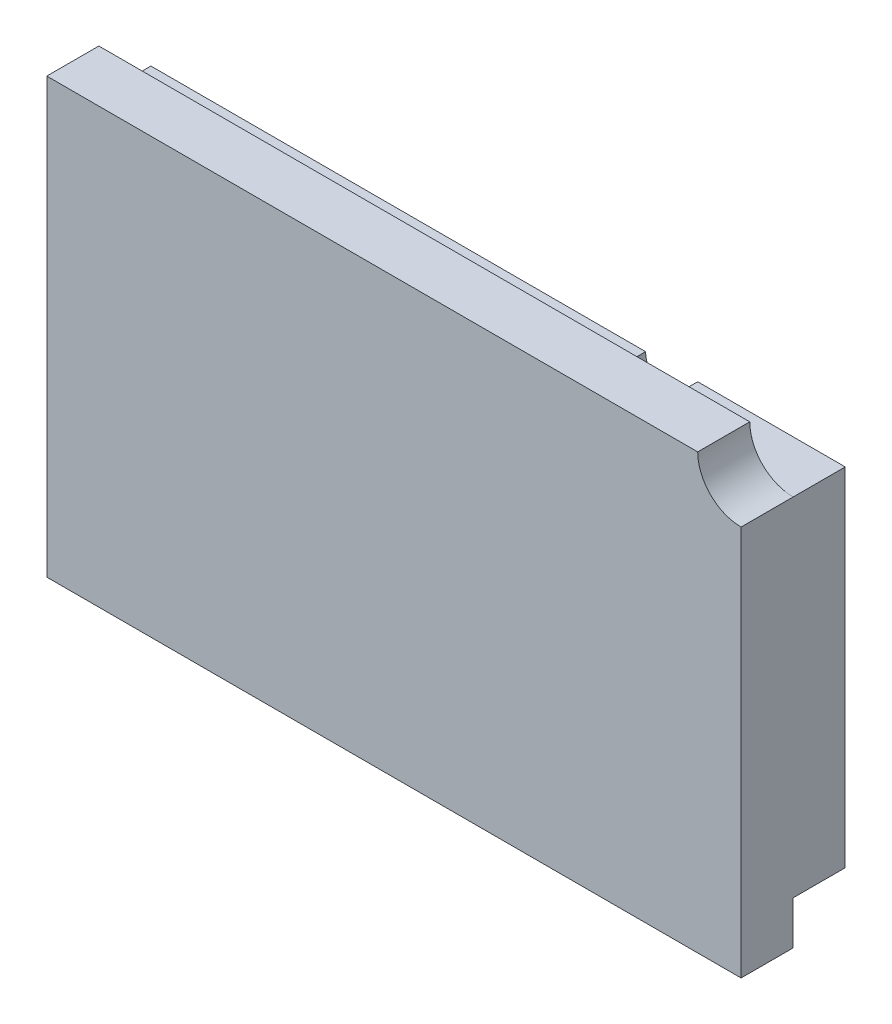
ISO-10303-21;
HEADER;
FILE_DESCRIPTION(('STEP AP214'),'2;1');
FILE_NAME('part.step','',(''),(''),'','','');
FILE_SCHEMA(('AUTOMOTIVE_DESIGN { 1 0 10303 214 1 1 1 1 }'));
ENDSEC;
DATA;
#1=APPLICATION_CONTEXT('core data for automotive mechanical design processes');
#2=APPLICATION_PROTOCOL_DEFINITION('international standard','automotive_design',2000,#1);
#3=PRODUCT_CONTEXT('',#1,'mechanical');
#4=PRODUCT('Part','Part','',(#3));
#5=PRODUCT_RELATED_PRODUCT_CATEGORY('part','',(#4));
#6=PRODUCT_DEFINITION_FORMATION('','',#4);
#7=PRODUCT_DEFINITION_CONTEXT('part definition',#1,'design');
#8=PRODUCT_DEFINITION('design','',#6,#7);
#9=PRODUCT_DEFINITION_SHAPE('','',#8);
#10=(LENGTH_UNIT() NAMED_UNIT(*) SI_UNIT(.MILLI.,.METRE.));
#11=(NAMED_UNIT(*) PLANE_ANGLE_UNIT() SI_UNIT($,.RADIAN.));
#12=(NAMED_UNIT(*) SI_UNIT($,.STERADIAN.) SOLID_ANGLE_UNIT());
#13=UNCERTAINTY_MEASURE_WITH_UNIT(LENGTH_MEASURE(1.E-05),#10,'distance_accuracy_value','');
#14=(GEOMETRIC_REPRESENTATION_CONTEXT(3) GLOBAL_UNCERTAINTY_ASSIGNED_CONTEXT((#13)) GLOBAL_UNIT_ASSIGNED_CONTEXT((#10,
#11,#12)) REPRESENTATION_CONTEXT('',''));
#15=CARTESIAN_POINT('',(0.,0.,0.));
#16=DIRECTION('',(0.,0.,1.));
#17=DIRECTION('',(1.,0.,0.));
#18=AXIS2_PLACEMENT_3D('',#15,#16,#17);
#19=CARTESIAN_POINT('',(40.,25.,6.));
#20=DIRECTION('',(0.,0.,-1.));
#21=DIRECTION('',(1.,0.,0.));
#22=AXIS2_PLACEMENT_3D('',#19,#20,#21);
#23=CYLINDRICAL_SURFACE('',#22,5.);
#24=CARTESIAN_POINT('',(40.,25.,6.));
#25=DIRECTION('',(0.,0.,1.));
#26=DIRECTION('',(1.,0.,0.));
#27=AXIS2_PLACEMENT_3D('',#24,#25,#26);
#28=CIRCLE('',#27,5.);
#29=CARTESIAN_POINT('',(35.,25.,6.));
#30=VERTEX_POINT('',#29);
#31=CARTESIAN_POINT('',(40.,20.,6.));
#32=VERTEX_POINT('',#31);
#33=EDGE_CURVE('E220',#30,#32,#28,.T.);
#34=ORIENTED_EDGE('',*,*,#33,.F.);
#35=DIRECTION('',(0.,0.,-1.));
#36=VECTOR('',#35,1.);
#37=CARTESIAN_POINT('',(35.,25.,6.));
#38=LINE('',#37,#36);
#39=CARTESIAN_POINT('',(35.,25.,12.));
#40=VERTEX_POINT('',#39);
#41=EDGE_CURVE('E24',#40,#30,#38,.T.);
#42=ORIENTED_EDGE('',*,*,#41,.F.);
#43=CARTESIAN_POINT('',(40.,25.,12.));
#44=DIRECTION('',(0.,0.,-1.));
#45=DIRECTION('',(1.,0.,0.));
#46=AXIS2_PLACEMENT_3D('',#43,#44,#45);
#47=CIRCLE('',#46,5.);
#48=CARTESIAN_POINT('',(40.,20.,12.));
#49=VERTEX_POINT('',#48);
#50=EDGE_CURVE('E10',#49,#40,#47,.T.);
#51=ORIENTED_EDGE('',*,*,#50,.F.);
#52=DIRECTION('',(0.,0.,-1.));
#53=VECTOR('',#52,1.);
#54=CARTESIAN_POINT('',(40.,20.,6.));
#55=LINE('',#54,#53);
#56=EDGE_CURVE('E161',#49,#32,#55,.T.);
#57=ORIENTED_EDGE('',*,*,#56,.T.);
#58=EDGE_LOOP('',(#34,#42,#51,#57));
#59=FACE_BOUND('',#58,.T.);
#60=ADVANCED_FACE('F16',(#59),#23,.F.);
#61=CARTESIAN_POINT('',(0.,0.,12.));
#62=DIRECTION('',(0.,0.,1.));
#63=DIRECTION('',(1.,0.,0.));
#64=AXIS2_PLACEMENT_3D('',#61,#62,#63);
#65=PLANE('',#64);
#66=DIRECTION('',(0.,-1.,0.));
#67=VECTOR('',#66,1.);
#68=CARTESIAN_POINT('',(-40.,25.,12.));
#69=LINE('',#68,#67);
#70=CARTESIAN_POINT('',(-40.,25.,12.));
#71=VERTEX_POINT('',#70);
#72=CARTESIAN_POINT('',(-40.,-25.,12.));
#73=VERTEX_POINT('',#72);
#74=EDGE_CURVE('E157',#71,#73,#69,.T.);
#75=ORIENTED_EDGE('',*,*,#74,.T.);
#76=DIRECTION('',(1.,0.,0.));
#77=VECTOR('',#76,1.);
#78=CARTESIAN_POINT('',(-40.,-25.,12.));
#79=LINE('',#78,#77);
#80=CARTESIAN_POINT('',(40.,-25.,12.));
#81=VERTEX_POINT('',#80);
#82=EDGE_CURVE('E217',#73,#81,#79,.T.);
#83=ORIENTED_EDGE('',*,*,#82,.T.);
#84=DIRECTION('',(0.,1.,0.));
#85=VECTOR('',#84,1.);
#86=CARTESIAN_POINT('',(40.,-25.,12.));
#87=LINE('',#86,#85);
#88=EDGE_CURVE('E164',#81,#49,#87,.T.);
#89=ORIENTED_EDGE('',*,*,#88,.T.);
#90=ORIENTED_EDGE('',*,*,#50,.T.);
#91=DIRECTION('',(-1.,0.,0.));
#92=VECTOR('',#91,1.);
#93=CARTESIAN_POINT('',(40.,25.,12.));
#94=LINE('',#93,#92);
#95=EDGE_CURVE('E236',#40,#71,#94,.T.);
#96=ORIENTED_EDGE('',*,*,#95,.T.);
#97=EDGE_LOOP('',(#75,#83,#89,#90,#96));
#98=FACE_BOUND('',#97,.T.);
#99=ADVANCED_FACE('F335',(#98),#65,.T.);
#100=CARTESIAN_POINT('',(40.,25.,6.));
#101=DIRECTION('',(0.,-1.,0.));
#102=DIRECTION('',(0.,0.,-1.));
#103=AXIS2_PLACEMENT_3D('',#100,#101,#102);
#104=PLANE('',#103);
#105=DIRECTION('',(0.,0.,1.));
#106=VECTOR('',#105,1.);
#107=CARTESIAN_POINT('',(-40.,25.,6.));
#108=LINE('',#107,#106);
#109=CARTESIAN_POINT('',(-40.,25.,6.));
#110=VERTEX_POINT('',#109);
#111=EDGE_CURVE('E172',#110,#71,#108,.T.);
#112=ORIENTED_EDGE('',*,*,#111,.T.);
#113=ORIENTED_EDGE('',*,*,#95,.F.);
#114=ORIENTED_EDGE('',*,*,#41,.T.);
#115=DIRECTION('',(-1.,0.,0.));
#116=VECTOR('',#115,1.);
#117=CARTESIAN_POINT('',(40.,25.,6.));
#118=LINE('',#117,#116);
#119=EDGE_CURVE('E233',#30,#110,#118,.T.);
#120=ORIENTED_EDGE('',*,*,#119,.T.);
#121=EDGE_LOOP('',(#112,#113,#114,#120));
#122=FACE_BOUND('',#121,.T.);
#123=ADVANCED_FACE('F326',(#122),#104,.F.);
#124=CARTESIAN_POINT('',(0.,0.,6.));
#125=DIRECTION('',(0.,0.,1.));
#126=DIRECTION('',(1.,0.,0.));
#127=AXIS2_PLACEMENT_3D('',#124,#125,#126);
#128=PLANE('',#127);
#129=ORIENTED_EDGE('',*,*,#33,.T.);
#130=DIRECTION('',(-1.,0.,0.));
#131=VECTOR('',#130,1.);
#132=CARTESIAN_POINT('',(40.,20.,6.));
#133=LINE('',#132,#131);
#134=CARTESIAN_POINT('',(23.,20.,6.));
#135=VERTEX_POINT('',#134);
#136=EDGE_CURVE('E225',#32,#135,#133,.T.);
#137=ORIENTED_EDGE('',*,*,#136,.T.);
#138=CARTESIAN_POINT('',(20.,20.,6.));
#139=DIRECTION('',(0.,0.,-1.));
#140=DIRECTION('',(1.,0.,0.));
#141=AXIS2_PLACEMENT_3D('',#138,#139,#140);
#142=CIRCLE('',#141,3.);
#143=CARTESIAN_POINT('',(17.,20.,6.));
#144=VERTEX_POINT('',#143);
#145=EDGE_CURVE('E221',#135,#144,#142,.T.);
#146=ORIENTED_EDGE('',*,*,#145,.T.);
#147=DIRECTION('',(-1.,0.,0.));
#148=VECTOR('',#147,1.);
#149=CARTESIAN_POINT('',(40.,20.,6.));
#150=LINE('',#149,#148);
#151=CARTESIAN_POINT('',(-40.,20.,6.));
#152=VERTEX_POINT('',#151);
#153=EDGE_CURVE('E210',#144,#152,#150,.T.);
#154=ORIENTED_EDGE('',*,*,#153,.T.);
#155=DIRECTION('',(0.,-1.,0.));
#156=VECTOR('',#155,1.);
#157=CARTESIAN_POINT('',(-40.,25.,6.));
#158=LINE('',#157,#156);
#159=EDGE_CURVE('E169',#110,#152,#158,.T.);
#160=ORIENTED_EDGE('',*,*,#159,.F.);
#161=ORIENTED_EDGE('',*,*,#119,.F.);
#162=EDGE_LOOP('',(#129,#137,#146,#154,#160,#161));
#163=FACE_BOUND('',#162,.T.);
#164=ADVANCED_FACE('F317',(#163),#128,.F.);
#165=CARTESIAN_POINT('',(-40.,-25.,6.));
#166=DIRECTION('',(0.,1.,0.));
#167=DIRECTION('',(1.,0.,0.));
#168=AXIS2_PLACEMENT_3D('',#165,#166,#167);
#169=PLANE('',#168);
#170=DIRECTION('',(1.,0.,0.));
#171=VECTOR('',#170,1.);
#172=CARTESIAN_POINT('',(-40.,-25.,6.));
#173=LINE('',#172,#171);
#174=CARTESIAN_POINT('',(-40.,-25.,6.));
#175=VERTEX_POINT('',#174);
#176=CARTESIAN_POINT('',(40.,-25.,6.));
#177=VERTEX_POINT('',#176);
#178=EDGE_CURVE('E207',#175,#177,#173,.T.);
#179=ORIENTED_EDGE('',*,*,#178,.T.);
#180=DIRECTION('',(0.,0.,1.));
#181=VECTOR('',#180,1.);
#182=CARTESIAN_POINT('',(40.,-25.,6.));
#183=LINE('',#182,#181);
#184=EDGE_CURVE('E190',#177,#81,#183,.T.);
#185=ORIENTED_EDGE('',*,*,#184,.T.);
#186=ORIENTED_EDGE('',*,*,#82,.F.);
#187=DIRECTION('',(0.,0.,1.));
#188=VECTOR('',#187,1.);
#189=CARTESIAN_POINT('',(-40.,-25.,6.));
#190=LINE('',#189,#188);
#191=EDGE_CURVE('E175',#175,#73,#190,.T.);
#192=ORIENTED_EDGE('',*,*,#191,.F.);
#193=EDGE_LOOP('',(#179,#185,#186,#192));
#194=FACE_BOUND('',#193,.T.);
#195=ADVANCED_FACE('F301',(#194),#169,.F.);
#196=CARTESIAN_POINT('',(20.,20.,0.));
#197=DIRECTION('',(0.,0.,-1.));
#198=DIRECTION('',(1.,0.,0.));
#199=AXIS2_PLACEMENT_3D('',#196,#197,#198);
#200=CYLINDRICAL_SURFACE('',#199,3.);
#201=DIRECTION('',(0.,0.,1.));
#202=VECTOR('',#201,1.);
#203=CARTESIAN_POINT('',(23.,20.,0.));
#204=LINE('',#203,#202);
#205=CARTESIAN_POINT('',(23.,20.,0.));
#206=VERTEX_POINT('',#205);
#207=EDGE_CURVE('E216',#206,#135,#204,.T.);
#208=ORIENTED_EDGE('',*,*,#207,.F.);
#209=CARTESIAN_POINT('',(20.,20.,0.));
#210=DIRECTION('',(0.,0.,1.));
#211=DIRECTION('',(1.,0.,0.));
#212=AXIS2_PLACEMENT_3D('',#209,#210,#211);
#213=CIRCLE('',#212,3.);
#214=CARTESIAN_POINT('',(17.,20.,0.));
#215=VERTEX_POINT('',#214);
#216=EDGE_CURVE('E184',#215,#206,#213,.T.);
#217=ORIENTED_EDGE('',*,*,#216,.F.);
#218=DIRECTION('',(0.,0.,-1.));
#219=VECTOR('',#218,1.);
#220=CARTESIAN_POINT('',(17.,20.,0.));
#221=LINE('',#220,#219);
#222=EDGE_CURVE('E213',#144,#215,#221,.T.);
#223=ORIENTED_EDGE('',*,*,#222,.F.);
#224=ORIENTED_EDGE('',*,*,#145,.F.);
#225=EDGE_LOOP('',(#208,#217,#223,#224));
#226=FACE_BOUND('',#225,.T.);
#227=ADVANCED_FACE('F284',(#226),#200,.F.);
#228=CARTESIAN_POINT('',(40.,20.,0.));
#229=DIRECTION('',(0.,-1.,0.));
#230=DIRECTION('',(0.,0.,-1.));
#231=AXIS2_PLACEMENT_3D('',#228,#229,#230);
#232=PLANE('',#231);
#233=ORIENTED_EDGE('',*,*,#207,.T.);
#234=ORIENTED_EDGE('',*,*,#136,.F.);
#235=DIRECTION('',(0.,0.,1.));
#236=VECTOR('',#235,1.);
#237=CARTESIAN_POINT('',(40.,20.,0.));
#238=LINE('',#237,#236);
#239=CARTESIAN_POINT('',(40.,20.,0.));
#240=VERTEX_POINT('',#239);
#241=EDGE_CURVE('E165',#240,#32,#238,.T.);
#242=ORIENTED_EDGE('',*,*,#241,.F.);
#243=DIRECTION('',(-1.,0.,0.));
#244=VECTOR('',#243,1.);
#245=CARTESIAN_POINT('',(40.,20.,0.));
#246=LINE('',#245,#244);
#247=EDGE_CURVE('E188',#240,#206,#246,.T.);
#248=ORIENTED_EDGE('',*,*,#247,.T.);
#249=EDGE_LOOP('',(#233,#234,#242,#248));
#250=FACE_BOUND('',#249,.T.);
#251=ADVANCED_FACE('F278',(#250),#232,.F.);
#252=CARTESIAN_POINT('',(40.,20.,0.));
#253=DIRECTION('',(0.,-1.,0.));
#254=DIRECTION('',(0.,0.,-1.));
#255=AXIS2_PLACEMENT_3D('',#252,#253,#254);
#256=PLANE('',#255);
#257=DIRECTION('',(0.,0.,1.));
#258=VECTOR('',#257,1.);
#259=CARTESIAN_POINT('',(-40.,20.,0.));
#260=LINE('',#259,#258);
#261=CARTESIAN_POINT('',(-40.,20.,0.));
#262=VERTEX_POINT('',#261);
#263=EDGE_CURVE('E129',#262,#152,#260,.T.);
#264=ORIENTED_EDGE('',*,*,#263,.T.);
#265=ORIENTED_EDGE('',*,*,#153,.F.);
#266=ORIENTED_EDGE('',*,*,#222,.T.);
#267=DIRECTION('',(-1.,0.,0.));
#268=VECTOR('',#267,1.);
#269=CARTESIAN_POINT('',(40.,20.,0.));
#270=LINE('',#269,#268);
#271=EDGE_CURVE('E189',#215,#262,#270,.T.);
#272=ORIENTED_EDGE('',*,*,#271,.T.);
#273=EDGE_LOOP('',(#264,#265,#266,#272));
#274=FACE_BOUND('',#273,.T.);
#275=ADVANCED_FACE('F283',(#274),#256,.F.);
#276=CARTESIAN_POINT('',(0.,0.,6.));
#277=DIRECTION('',(0.,0.,1.));
#278=DIRECTION('',(1.,0.,0.));
#279=AXIS2_PLACEMENT_3D('',#276,#277,#278);
#280=PLANE('',#279);
#281=DIRECTION('',(0.,1.,0.));
#282=VECTOR('',#281,1.);
#283=CARTESIAN_POINT('',(40.,-25.,6.));
#284=LINE('',#283,#282);
#285=CARTESIAN_POINT('',(40.,-20.,6.));
#286=VERTEX_POINT('',#285);
#287=EDGE_CURVE('E194',#177,#286,#284,.T.);
#288=ORIENTED_EDGE('',*,*,#287,.F.);
#289=ORIENTED_EDGE('',*,*,#178,.F.);
#290=DIRECTION('',(0.,-1.,0.));
#291=VECTOR('',#290,1.);
#292=CARTESIAN_POINT('',(-40.,25.,6.));
#293=LINE('',#292,#291);
#294=CARTESIAN_POINT('',(-40.,-20.,6.));
#295=VERTEX_POINT('',#294);
#296=EDGE_CURVE('E134',#295,#175,#293,.T.);
#297=ORIENTED_EDGE('',*,*,#296,.F.);
#298=DIRECTION('',(1.,0.,0.));
#299=VECTOR('',#298,1.);
#300=CARTESIAN_POINT('',(-40.,-20.,6.));
#301=LINE('',#300,#299);
#302=EDGE_CURVE('E142',#295,#286,#301,.T.);
#303=ORIENTED_EDGE('',*,*,#302,.T.);
#304=EDGE_LOOP('',(#288,#289,#297,#303));
#305=FACE_BOUND('',#304,.T.);
#306=ADVANCED_FACE('F273',(#305),#280,.F.);
#307=CARTESIAN_POINT('',(0.,0.,0.));
#308=DIRECTION('',(0.,0.,1.));
#309=DIRECTION('',(1.,0.,0.));
#310=AXIS2_PLACEMENT_3D('',#307,#308,#309);
#311=PLANE('',#310);
#312=ORIENTED_EDGE('',*,*,#271,.F.);
#313=ORIENTED_EDGE('',*,*,#216,.T.);
#314=ORIENTED_EDGE('',*,*,#247,.F.);
#315=DIRECTION('',(0.,1.,0.));
#316=VECTOR('',#315,1.);
#317=CARTESIAN_POINT('',(40.,-20.,0.));
#318=LINE('',#317,#316);
#319=CARTESIAN_POINT('',(40.,-20.,0.));
#320=VERTEX_POINT('',#319);
#321=EDGE_CURVE('E147',#320,#240,#318,.T.);
#322=ORIENTED_EDGE('',*,*,#321,.F.);
#323=DIRECTION('',(1.,0.,0.));
#324=VECTOR('',#323,1.);
#325=CARTESIAN_POINT('',(-40.,-20.,0.));
#326=LINE('',#325,#324);
#327=CARTESIAN_POINT('',(-40.,-20.,0.));
#328=VERTEX_POINT('',#327);
#329=EDGE_CURVE('E140',#328,#320,#326,.T.);
#330=ORIENTED_EDGE('',*,*,#329,.F.);
#331=DIRECTION('',(0.,-1.,0.));
#332=VECTOR('',#331,1.);
#333=CARTESIAN_POINT('',(-40.,20.,0.));
#334=LINE('',#333,#332);
#335=EDGE_CURVE('E121',#262,#328,#334,.T.);
#336=ORIENTED_EDGE('',*,*,#335,.F.);
#337=EDGE_LOOP('',(#312,#313,#314,#322,#330,#336));
#338=FACE_BOUND('',#337,.T.);
#339=ADVANCED_FACE('F145',(#338),#311,.F.);
#340=CARTESIAN_POINT('',(40.,-20.,0.));
#341=DIRECTION('',(-1.,0.,0.));
#342=DIRECTION('',(0.,0.,1.));
#343=AXIS2_PLACEMENT_3D('',#340,#341,#342);
#344=PLANE('',#343);
#345=ORIENTED_EDGE('',*,*,#321,.T.);
#346=ORIENTED_EDGE('',*,*,#241,.T.);
#347=ORIENTED_EDGE('',*,*,#56,.F.);
#348=ORIENTED_EDGE('',*,*,#88,.F.);
#349=ORIENTED_EDGE('',*,*,#184,.F.);
#350=ORIENTED_EDGE('',*,*,#287,.T.);
#351=DIRECTION('',(0.,0.,1.));
#352=VECTOR('',#351,1.);
#353=CARTESIAN_POINT('',(40.,-20.,0.));
#354=LINE('',#353,#352);
#355=EDGE_CURVE('E150',#320,#286,#354,.T.);
#356=ORIENTED_EDGE('',*,*,#355,.F.);
#357=EDGE_LOOP('',(#345,#346,#347,#348,#349,#350,#356));
#358=FACE_BOUND('',#357,.T.);
#359=ADVANCED_FACE('F257',(#358),#344,.F.);
#360=CARTESIAN_POINT('',(-40.,20.,0.));
#361=DIRECTION('',(1.,0.,0.));
#362=DIRECTION('',(0.,1.,0.));
#363=AXIS2_PLACEMENT_3D('',#360,#361,#362);
#364=PLANE('',#363);
#365=ORIENTED_EDGE('',*,*,#335,.T.);
#366=DIRECTION('',(0.,0.,1.));
#367=VECTOR('',#366,1.);
#368=CARTESIAN_POINT('',(-40.,-20.,0.));
#369=LINE('',#368,#367);
#370=EDGE_CURVE('E125',#328,#295,#369,.T.);
#371=ORIENTED_EDGE('',*,*,#370,.T.);
#372=ORIENTED_EDGE('',*,*,#296,.T.);
#373=ORIENTED_EDGE('',*,*,#191,.T.);
#374=ORIENTED_EDGE('',*,*,#74,.F.);
#375=ORIENTED_EDGE('',*,*,#111,.F.);
#376=ORIENTED_EDGE('',*,*,#159,.T.);
#377=ORIENTED_EDGE('',*,*,#263,.F.);
#378=EDGE_LOOP('',(#365,#371,#372,#373,#374,#375,#376,#377));
#379=FACE_BOUND('',#378,.T.);
#380=ADVANCED_FACE('F123',(#379),#364,.F.);
#381=CARTESIAN_POINT('',(-40.,-20.,0.));
#382=DIRECTION('',(0.,1.,0.));
#383=DIRECTION('',(1.,0.,0.));
#384=AXIS2_PLACEMENT_3D('',#381,#382,#383);
#385=PLANE('',#384);
#386=ORIENTED_EDGE('',*,*,#329,.T.);
#387=ORIENTED_EDGE('',*,*,#355,.T.);
#388=ORIENTED_EDGE('',*,*,#302,.F.);
#389=ORIENTED_EDGE('',*,*,#370,.F.);
#390=EDGE_LOOP('',(#386,#387,#388,#389));
#391=FACE_BOUND('',#390,.T.);
#392=ADVANCED_FACE('F138',(#391),#385,.F.);
#393=CLOSED_SHELL('',(#60,#99,#123,#164,#195,#227,#251,#275,#306,#339,#359,#380,#392));
#394=MANIFOLD_SOLID_BREP('B1',#393);
#395=ADVANCED_BREP_SHAPE_REPRESENTATION('',(#18,#394),#14);
#396=SHAPE_DEFINITION_REPRESENTATION(#9,#395);
ENDSEC;
END-ISO-10303-21;
